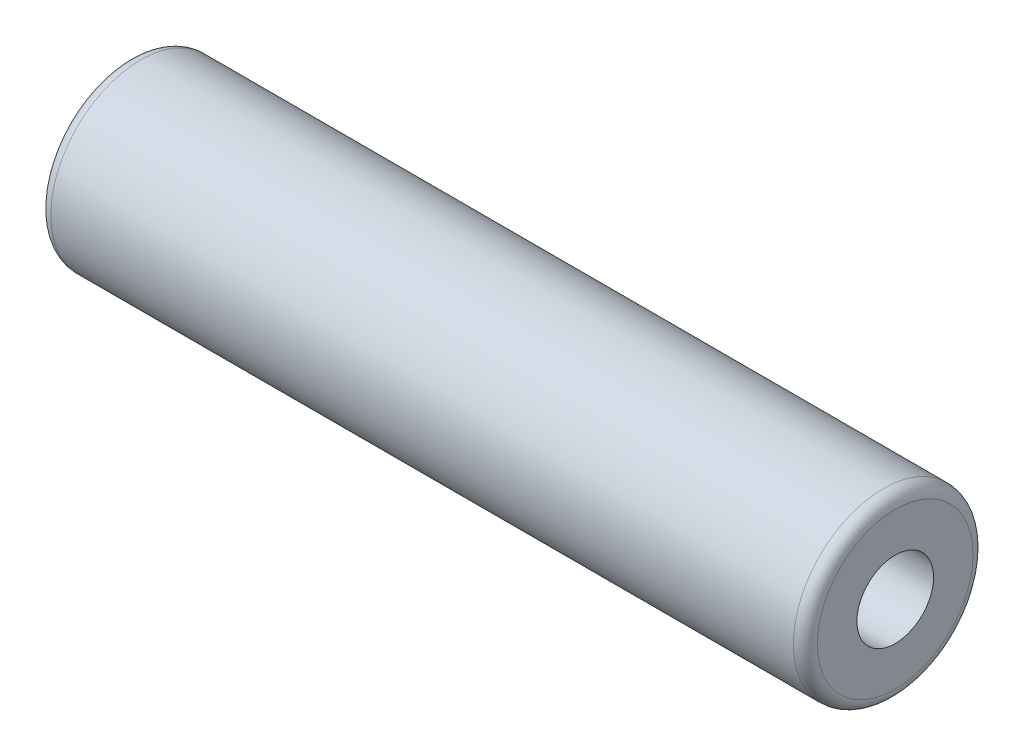
ISO-10303-21;
HEADER;
FILE_DESCRIPTION(('STEP AP214'),'2;1');
FILE_NAME('part.step','',(''),(''),'','','');
FILE_SCHEMA(('AUTOMOTIVE_DESIGN { 1 0 10303 214 1 1 1 1 }'));
ENDSEC;
DATA;
#1=APPLICATION_CONTEXT('core data for automotive mechanical design processes');
#2=APPLICATION_PROTOCOL_DEFINITION('international standard','automotive_design',2000,#1);
#3=PRODUCT_CONTEXT('',#1,'mechanical');
#4=PRODUCT('Part','Part','',(#3));
#5=PRODUCT_RELATED_PRODUCT_CATEGORY('part','',(#4));
#6=PRODUCT_DEFINITION_FORMATION('','',#4);
#7=PRODUCT_DEFINITION_CONTEXT('part definition',#1,'design');
#8=PRODUCT_DEFINITION('design','',#6,#7);
#9=PRODUCT_DEFINITION_SHAPE('','',#8);
#10=(LENGTH_UNIT() NAMED_UNIT(*) SI_UNIT(.MILLI.,.METRE.));
#11=(NAMED_UNIT(*) PLANE_ANGLE_UNIT() SI_UNIT($,.RADIAN.));
#12=(NAMED_UNIT(*) SI_UNIT($,.STERADIAN.) SOLID_ANGLE_UNIT());
#13=UNCERTAINTY_MEASURE_WITH_UNIT(LENGTH_MEASURE(1.E-05),#10,'distance_accuracy_value','');
#14=(GEOMETRIC_REPRESENTATION_CONTEXT(3) GLOBAL_UNCERTAINTY_ASSIGNED_CONTEXT((#13)) GLOBAL_UNIT_ASSIGNED_CONTEXT((#10,
#11,#12)) REPRESENTATION_CONTEXT('',''));
#15=CARTESIAN_POINT('',(0.,0.,0.));
#16=DIRECTION('',(0.,0.,1.));
#17=DIRECTION('',(1.,0.,0.));
#18=AXIS2_PLACEMENT_3D('',#15,#16,#17);
#19=CARTESIAN_POINT('',(20.32,0.,0.));
#20=DIRECTION('',(-1.,0.,0.));
#21=DIRECTION('',(0.,0.,1.));
#22=AXIS2_PLACEMENT_3D('',#19,#20,#21);
#23=CYLINDRICAL_SURFACE('',#22,4.7625);
#24=CARTESIAN_POINT('',(-19.685,0.,0.));
#25=DIRECTION('',(1.,0.,0.));
#26=DIRECTION('',(0.,0.,-1.));
#27=AXIS2_PLACEMENT_3D('',#24,#25,#26);
#28=CIRCLE('',#27,4.7625);
#29=CARTESIAN_POINT('',(-19.685,0.,-4.7625));
#30=VERTEX_POINT('',#29);
#31=EDGE_CURVE('E46',#30,#30,#28,.T.);
#32=ORIENTED_EDGE('',*,*,#31,.T.);
#33=EDGE_LOOP('',(#32));
#34=FACE_BOUND('',#33,.T.);
#35=CARTESIAN_POINT('',(19.685,0.,0.));
#36=DIRECTION('',(1.,0.,0.));
#37=DIRECTION('',(0.,0.,-1.));
#38=AXIS2_PLACEMENT_3D('',#35,#36,#37);
#39=CIRCLE('',#38,4.7625);
#40=CARTESIAN_POINT('',(19.685,0.,-4.7625));
#41=VERTEX_POINT('',#40);
#42=EDGE_CURVE('E50',#41,#41,#39,.F.);
#43=ORIENTED_EDGE('',*,*,#42,.T.);
#44=EDGE_LOOP('',(#43));
#45=FACE_BOUND('',#44,.T.);
#46=ADVANCED_FACE('F35',(#34,#45),#23,.T.);
#47=CARTESIAN_POINT('',(20.32,0.,0.));
#48=DIRECTION('',(1.,0.,0.));
#49=DIRECTION('',(0.,0.,-1.));
#50=AXIS2_PLACEMENT_3D('',#47,#48,#49);
#51=PLANE('',#50);
#52=CARTESIAN_POINT('',(20.32,0.,0.));
#53=DIRECTION('',(1.,0.,0.));
#54=DIRECTION('',(0.,0.,-1.));
#55=AXIS2_PLACEMENT_3D('',#52,#53,#54);
#56=CIRCLE('',#55,4.1275);
#57=CARTESIAN_POINT('',(20.32,0.,-4.1275));
#58=VERTEX_POINT('',#57);
#59=EDGE_CURVE('E10',#58,#58,#56,.T.);
#60=ORIENTED_EDGE('',*,*,#59,.T.);
#61=EDGE_LOOP('',(#60));
#62=FACE_BOUND('',#61,.T.);
#63=CARTESIAN_POINT('',(20.32,0.,0.));
#64=DIRECTION('',(1.,0.,0.));
#65=DIRECTION('',(0.,0.,-1.));
#66=AXIS2_PLACEMENT_3D('',#63,#64,#65);
#67=CIRCLE('',#66,2.032);
#68=CARTESIAN_POINT('',(20.32,0.,-2.032));
#69=VERTEX_POINT('',#68);
#70=EDGE_CURVE('E56',#69,#69,#67,.T.);
#71=ORIENTED_EDGE('',*,*,#70,.F.);
#72=EDGE_LOOP('',(#71));
#73=FACE_BOUND('',#72,.T.);
#74=ADVANCED_FACE('F71',(#62,#73),#51,.T.);
#75=CARTESIAN_POINT('',(-20.32,0.,0.));
#76=DIRECTION('',(1.,0.,0.));
#77=DIRECTION('',(0.,0.,-1.));
#78=AXIS2_PLACEMENT_3D('',#75,#76,#77);
#79=PLANE('',#78);
#80=CARTESIAN_POINT('',(-20.32,0.,0.));
#81=DIRECTION('',(1.,0.,0.));
#82=DIRECTION('',(0.,0.,-1.));
#83=AXIS2_PLACEMENT_3D('',#80,#81,#82);
#84=CIRCLE('',#83,4.1275);
#85=CARTESIAN_POINT('',(-20.32,0.,-4.1275));
#86=VERTEX_POINT('',#85);
#87=EDGE_CURVE('E42',#86,#86,#84,.F.);
#88=ORIENTED_EDGE('',*,*,#87,.T.);
#89=EDGE_LOOP('',(#88));
#90=FACE_BOUND('',#89,.T.);
#91=CARTESIAN_POINT('',(-20.32,0.,0.));
#92=DIRECTION('',(1.,0.,0.));
#93=DIRECTION('',(0.,0.,-1.));
#94=AXIS2_PLACEMENT_3D('',#91,#92,#93);
#95=CIRCLE('',#94,2.032);
#96=CARTESIAN_POINT('',(-20.32,0.,-2.032));
#97=VERTEX_POINT('',#96);
#98=EDGE_CURVE('E55',#97,#97,#95,.T.);
#99=ORIENTED_EDGE('',*,*,#98,.T.);
#100=EDGE_LOOP('',(#99));
#101=FACE_BOUND('',#100,.T.);
#102=ADVANCED_FACE('F62',(#90,#101),#79,.F.);
#103=CARTESIAN_POINT('',(-20.32,0.,0.));
#104=DIRECTION('',(1.,0.,0.));
#105=DIRECTION('',(0.,0.,-1.));
#106=AXIS2_PLACEMENT_3D('',#103,#104,#105);
#107=CYLINDRICAL_SURFACE('',#106,2.032);
#108=ORIENTED_EDGE('',*,*,#98,.F.);
#109=EDGE_LOOP('',(#108));
#110=FACE_BOUND('',#109,.T.);
#111=ORIENTED_EDGE('',*,*,#70,.T.);
#112=EDGE_LOOP('',(#111));
#113=FACE_BOUND('',#112,.T.);
#114=ADVANCED_FACE('F64',(#110,#113),#107,.F.);
#115=CARTESIAN_POINT('',(-19.685,0.,0.));
#116=DIRECTION('',(1.,0.,0.));
#117=DIRECTION('',(0.,0.,-1.));
#118=AXIS2_PLACEMENT_3D('',#115,#116,#117);
#119=TOROIDAL_SURFACE('',#118,4.1275,0.635);
#120=ORIENTED_EDGE('',*,*,#87,.F.);
#121=EDGE_LOOP('',(#120));
#122=FACE_BOUND('',#121,.T.);
#123=ORIENTED_EDGE('',*,*,#31,.F.);
#124=EDGE_LOOP('',(#123));
#125=FACE_BOUND('',#124,.T.);
#126=ADVANCED_FACE('F67',(#122,#125),#119,.T.);
#127=CARTESIAN_POINT('',(19.685,0.,0.));
#128=DIRECTION('',(1.,0.,0.));
#129=DIRECTION('',(0.,0.,-1.));
#130=AXIS2_PLACEMENT_3D('',#127,#128,#129);
#131=TOROIDAL_SURFACE('',#130,4.1275,0.635);
#132=ORIENTED_EDGE('',*,*,#42,.F.);
#133=EDGE_LOOP('',(#132));
#134=FACE_BOUND('',#133,.T.);
#135=ORIENTED_EDGE('',*,*,#59,.F.);
#136=EDGE_LOOP('',(#135));
#137=FACE_BOUND('',#136,.T.);
#138=ADVANCED_FACE('F37',(#134,#137),#131,.T.);
#139=CLOSED_SHELL('',(#46,#74,#102,#114,#126,#138));
#140=MANIFOLD_SOLID_BREP('B2',#139);
#141=ADVANCED_BREP_SHAPE_REPRESENTATION('',(#18,#140),#14);
#142=SHAPE_DEFINITION_REPRESENTATION(#9,#141);
ENDSEC;
END-ISO-10303-21;
